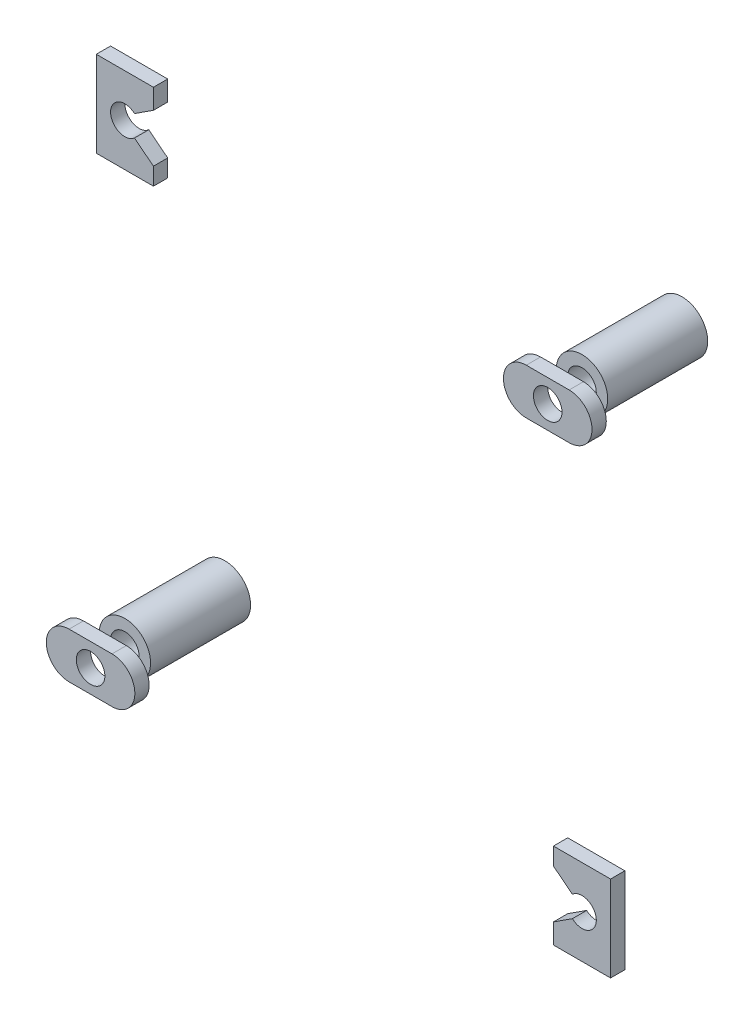
ISO-10303-21;
HEADER;
FILE_DESCRIPTION(('STEP AP214'),'2;1');
FILE_NAME('part.step','',(''),(''),'','','');
FILE_SCHEMA(('AUTOMOTIVE_DESIGN { 1 0 10303 214 1 1 1 1 }'));
ENDSEC;
DATA;
#1=APPLICATION_CONTEXT('core data for automotive mechanical design processes');
#2=APPLICATION_PROTOCOL_DEFINITION('international standard','automotive_design',2000,#1);
#3=PRODUCT_CONTEXT('',#1,'mechanical');
#4=PRODUCT('Part','Part','',(#3));
#5=PRODUCT_RELATED_PRODUCT_CATEGORY('part','',(#4));
#6=PRODUCT_DEFINITION_FORMATION('','',#4);
#7=PRODUCT_DEFINITION_CONTEXT('part definition',#1,'design');
#8=PRODUCT_DEFINITION('design','',#6,#7);
#9=PRODUCT_DEFINITION_SHAPE('','',#8);
#10=(LENGTH_UNIT() NAMED_UNIT(*) SI_UNIT(.MILLI.,.METRE.));
#11=(NAMED_UNIT(*) PLANE_ANGLE_UNIT() SI_UNIT($,.RADIAN.));
#12=(NAMED_UNIT(*) SI_UNIT($,.STERADIAN.) SOLID_ANGLE_UNIT());
#13=UNCERTAINTY_MEASURE_WITH_UNIT(LENGTH_MEASURE(1.E-05),#10,'distance_accuracy_value','');
#14=(GEOMETRIC_REPRESENTATION_CONTEXT(3) GLOBAL_UNCERTAINTY_ASSIGNED_CONTEXT((#13)) GLOBAL_UNIT_ASSIGNED_CONTEXT((#10,
#11,#12)) REPRESENTATION_CONTEXT('',''));
#15=CARTESIAN_POINT('',(0.,0.,0.));
#16=DIRECTION('',(0.,0.,1.));
#17=DIRECTION('',(1.,0.,0.));
#18=AXIS2_PLACEMENT_3D('',#15,#16,#17);
#19=CARTESIAN_POINT('',(-80.,-80.0000000000001,448.285128968018));
#20=DIRECTION('',(0.,0.,1.));
#21=DIRECTION('',(1.,0.,0.));
#22=AXIS2_PLACEMENT_3D('',#19,#20,#21);
#23=PLANE('',#22);
#24=CARTESIAN_POINT('',(-80.,-80.0000000000001,448.285128968018));
#25=DIRECTION('',(0.,0.,1.));
#26=DIRECTION('',(1.,0.,0.));
#27=AXIS2_PLACEMENT_3D('',#24,#25,#26);
#28=CIRCLE('',#27,9.);
#29=CARTESIAN_POINT('',(-71.,-80.0000000000001,448.285128968018));
#30=VERTEX_POINT('',#29);
#31=EDGE_CURVE('P0_E10',#30,#30,#28,.T.);
#32=ORIENTED_EDGE('',*,*,#31,.T.);
#33=EDGE_LOOP('',(#32));
#34=FACE_BOUND('',#33,.T.);
#35=CARTESIAN_POINT('',(-80.,-80.0000000000001,448.285128968018));
#36=DIRECTION('',(0.,0.,1.));
#37=DIRECTION('',(1.,0.,0.));
#38=AXIS2_PLACEMENT_3D('',#35,#36,#37);
#39=CIRCLE('',#38,5.);
#40=CARTESIAN_POINT('',(-75.,-80.0000000000001,448.285128968018));
#41=VERTEX_POINT('',#40);
#42=EDGE_CURVE('P0_E26',#41,#41,#39,.T.);
#43=ORIENTED_EDGE('',*,*,#42,.F.);
#44=EDGE_LOOP('',(#43));
#45=FACE_BOUND('',#44,.T.);
#46=ADVANCED_FACE('P0_F15',(#34,#45),#23,.T.);
#47=CARTESIAN_POINT('',(-80.,-80.0000000000001,413.285128968018));
#48=DIRECTION('',(0.,0.,1.));
#49=DIRECTION('',(1.,0.,0.));
#50=AXIS2_PLACEMENT_3D('',#47,#48,#49);
#51=PLANE('',#50);
#52=CARTESIAN_POINT('',(-80.,-80.0000000000001,413.285128968018));
#53=DIRECTION('',(0.,0.,1.));
#54=DIRECTION('',(1.,0.,0.));
#55=AXIS2_PLACEMENT_3D('',#52,#53,#54);
#56=CIRCLE('',#55,9.);
#57=CARTESIAN_POINT('',(-71.,-80.0000000000001,413.285128968018));
#58=VERTEX_POINT('',#57);
#59=EDGE_CURVE('P0_E19',#58,#58,#56,.T.);
#60=ORIENTED_EDGE('',*,*,#59,.F.);
#61=EDGE_LOOP('',(#60));
#62=FACE_BOUND('',#61,.T.);
#63=CARTESIAN_POINT('',(-80.,-80.0000000000001,413.285128968018));
#64=DIRECTION('',(0.,0.,1.));
#65=DIRECTION('',(1.,0.,0.));
#66=AXIS2_PLACEMENT_3D('',#63,#64,#65);
#67=CIRCLE('',#66,5.);
#68=CARTESIAN_POINT('',(-75.,-80.0000000000001,413.285128968018));
#69=VERTEX_POINT('',#68);
#70=EDGE_CURVE('P0_E28',#69,#69,#67,.T.);
#71=ORIENTED_EDGE('',*,*,#70,.T.);
#72=EDGE_LOOP('',(#71));
#73=FACE_BOUND('',#72,.T.);
#74=ADVANCED_FACE('P0_F38',(#62,#73),#51,.F.);
#75=CARTESIAN_POINT('',(-80.,-80.0000000000001,448.285128968018));
#76=DIRECTION('',(0.,0.,-1.));
#77=DIRECTION('',(-1.,0.,0.));
#78=AXIS2_PLACEMENT_3D('',#75,#76,#77);
#79=CYLINDRICAL_SURFACE('',#78,9.);
#80=ORIENTED_EDGE('',*,*,#31,.F.);
#81=EDGE_LOOP('',(#80));
#82=FACE_BOUND('',#81,.T.);
#83=ORIENTED_EDGE('',*,*,#59,.T.);
#84=EDGE_LOOP('',(#83));
#85=FACE_BOUND('',#84,.T.);
#86=ADVANCED_FACE('P0_F17',(#82,#85),#79,.T.);
#87=CARTESIAN_POINT('',(-80.,-80.0000000000001,448.285128968018));
#88=DIRECTION('',(0.,0.,-1.));
#89=DIRECTION('',(-1.,0.,0.));
#90=AXIS2_PLACEMENT_3D('',#87,#88,#89);
#91=CYLINDRICAL_SURFACE('',#90,5.);
#92=ORIENTED_EDGE('',*,*,#42,.T.);
#93=EDGE_LOOP('',(#92));
#94=FACE_BOUND('',#93,.T.);
#95=ORIENTED_EDGE('',*,*,#70,.F.);
#96=EDGE_LOOP('',(#95));
#97=FACE_BOUND('',#96,.T.);
#98=ADVANCED_FACE('P0_F34',(#94,#97),#91,.F.);
#99=CLOSED_SHELL('',(#46,#74,#86,#98));
#100=MANIFOLD_SOLID_BREP('P0_B1',#99);
#101=CARTESIAN_POINT('',(80.,79.9999999999999,448.285128968018));
#102=DIRECTION('',(0.,0.,1.));
#103=DIRECTION('',(1.,0.,0.));
#104=AXIS2_PLACEMENT_3D('',#101,#102,#103);
#105=PLANE('',#104);
#106=CARTESIAN_POINT('',(80.,79.9999999999999,448.285128968018));
#107=DIRECTION('',(0.,0.,1.));
#108=DIRECTION('',(1.,0.,0.));
#109=AXIS2_PLACEMENT_3D('',#106,#107,#108);
#110=CIRCLE('',#109,9.);
#111=CARTESIAN_POINT('',(89.,79.9999999999999,448.285128968018));
#112=VERTEX_POINT('',#111);
#113=EDGE_CURVE('P1_E10',#112,#112,#110,.T.);
#114=ORIENTED_EDGE('',*,*,#113,.T.);
#115=EDGE_LOOP('',(#114));
#116=FACE_BOUND('',#115,.T.);
#117=CARTESIAN_POINT('',(80.,79.9999999999999,448.285128968018));
#118=DIRECTION('',(0.,0.,1.));
#119=DIRECTION('',(1.,0.,0.));
#120=AXIS2_PLACEMENT_3D('',#117,#118,#119);
#121=CIRCLE('',#120,5.);
#122=CARTESIAN_POINT('',(85.,79.9999999999999,448.285128968018));
#123=VERTEX_POINT('',#122);
#124=EDGE_CURVE('P1_E26',#123,#123,#121,.T.);
#125=ORIENTED_EDGE('',*,*,#124,.F.);
#126=EDGE_LOOP('',(#125));
#127=FACE_BOUND('',#126,.T.);
#128=ADVANCED_FACE('P1_F15',(#116,#127),#105,.T.);
#129=CARTESIAN_POINT('',(80.,79.9999999999999,413.285128968018));
#130=DIRECTION('',(0.,0.,1.));
#131=DIRECTION('',(1.,0.,0.));
#132=AXIS2_PLACEMENT_3D('',#129,#130,#131);
#133=PLANE('',#132);
#134=CARTESIAN_POINT('',(80.,79.9999999999999,413.285128968018));
#135=DIRECTION('',(0.,0.,1.));
#136=DIRECTION('',(1.,0.,0.));
#137=AXIS2_PLACEMENT_3D('',#134,#135,#136);
#138=CIRCLE('',#137,9.);
#139=CARTESIAN_POINT('',(89.,79.9999999999999,413.285128968018));
#140=VERTEX_POINT('',#139);
#141=EDGE_CURVE('P1_E19',#140,#140,#138,.T.);
#142=ORIENTED_EDGE('',*,*,#141,.F.);
#143=EDGE_LOOP('',(#142));
#144=FACE_BOUND('',#143,.T.);
#145=CARTESIAN_POINT('',(80.,79.9999999999999,413.285128968018));
#146=DIRECTION('',(0.,0.,1.));
#147=DIRECTION('',(1.,0.,0.));
#148=AXIS2_PLACEMENT_3D('',#145,#146,#147);
#149=CIRCLE('',#148,5.);
#150=CARTESIAN_POINT('',(85.,79.9999999999999,413.285128968018));
#151=VERTEX_POINT('',#150);
#152=EDGE_CURVE('P1_E28',#151,#151,#149,.T.);
#153=ORIENTED_EDGE('',*,*,#152,.T.);
#154=EDGE_LOOP('',(#153));
#155=FACE_BOUND('',#154,.T.);
#156=ADVANCED_FACE('P1_F38',(#144,#155),#133,.F.);
#157=CARTESIAN_POINT('',(80.,79.9999999999999,448.285128968018));
#158=DIRECTION('',(0.,0.,-1.));
#159=DIRECTION('',(-1.,0.,0.));
#160=AXIS2_PLACEMENT_3D('',#157,#158,#159);
#161=CYLINDRICAL_SURFACE('',#160,9.);
#162=ORIENTED_EDGE('',*,*,#113,.F.);
#163=EDGE_LOOP('',(#162));
#164=FACE_BOUND('',#163,.T.);
#165=ORIENTED_EDGE('',*,*,#141,.T.);
#166=EDGE_LOOP('',(#165));
#167=FACE_BOUND('',#166,.T.);
#168=ADVANCED_FACE('P1_F17',(#164,#167),#161,.T.);
#169=CARTESIAN_POINT('',(80.,79.9999999999999,448.285128968018));
#170=DIRECTION('',(0.,0.,-1.));
#171=DIRECTION('',(-1.,0.,0.));
#172=AXIS2_PLACEMENT_3D('',#169,#170,#171);
#173=CYLINDRICAL_SURFACE('',#172,5.);
#174=ORIENTED_EDGE('',*,*,#124,.T.);
#175=EDGE_LOOP('',(#174));
#176=FACE_BOUND('',#175,.T.);
#177=ORIENTED_EDGE('',*,*,#152,.F.);
#178=EDGE_LOOP('',(#177));
#179=FACE_BOUND('',#178,.T.);
#180=ADVANCED_FACE('P1_F34',(#176,#179),#173,.F.);
#181=CLOSED_SHELL('',(#128,#156,#168,#180));
#182=MANIFOLD_SOLID_BREP('P1_B1',#181);
#183=CARTESIAN_POINT('',(-70.,71.0749620758152,448.285128968018));
#184=DIRECTION('',(-0.618788332961587,-0.785557762987942,0.));
#185=DIRECTION('',(0.785557762987942,-0.618788332961587,0.));
#186=AXIS2_PLACEMENT_3D('',#183,#184,#185);
#187=PLANE('',#186);
#188=DIRECTION('',(-0.785557762987942,0.618788332961587,0.));
#189=VECTOR('',#188,1.);
#190=CARTESIAN_POINT('',(-70.,71.0749620758152,443.285128968018));
#191=LINE('',#190,#189);
#192=CARTESIAN_POINT('',(-70.,71.0749620758152,443.285128968018));
#193=VERTEX_POINT('',#192);
#194=CARTESIAN_POINT('',(-76.6352345462613,76.3015741941568,443.285128968018));
#195=VERTEX_POINT('',#194);
#196=EDGE_CURVE('P2_E111',#193,#195,#191,.T.);
#197=ORIENTED_EDGE('',*,*,#196,.T.);
#198=DIRECTION('',(0.,0.,-1.));
#199=VECTOR('',#198,1.);
#200=CARTESIAN_POINT('',(-76.6352345462613,76.3015741941568,448.285128968018));
#201=LINE('',#200,#199);
#202=CARTESIAN_POINT('',(-76.6352345462613,76.3015741941568,448.285128968018));
#203=VERTEX_POINT('',#202);
#204=EDGE_CURVE('P2_E11',#203,#195,#201,.T.);
#205=ORIENTED_EDGE('',*,*,#204,.F.);
#206=DIRECTION('',(-0.785557762987942,0.618788332961587,0.));
#207=VECTOR('',#206,1.);
#208=CARTESIAN_POINT('',(-70.,71.0749620758152,448.285128968018));
#209=LINE('',#208,#207);
#210=CARTESIAN_POINT('',(-70.,71.0749620758152,448.285128968018));
#211=VERTEX_POINT('',#210);
#212=EDGE_CURVE('P2_E129',#211,#203,#209,.T.);
#213=ORIENTED_EDGE('',*,*,#212,.F.);
#214=DIRECTION('',(0.,0.,-1.));
#215=VECTOR('',#214,1.);
#216=CARTESIAN_POINT('',(-70.,71.0749620758152,448.285128968018));
#217=LINE('',#216,#215);
#218=EDGE_CURVE('P2_E107',#211,#193,#217,.T.);
#219=ORIENTED_EDGE('',*,*,#218,.T.);
#220=EDGE_LOOP('',(#197,#205,#213,#219));
#221=FACE_BOUND('',#220,.T.);
#222=ADVANCED_FACE('P2_F17',(#221),#187,.F.);
#223=CARTESIAN_POINT('',(-80.,79.9999999999999,448.285128968018));
#224=DIRECTION('',(0.,0.,-1.));
#225=DIRECTION('',(1.,0.,0.));
#226=AXIS2_PLACEMENT_3D('',#223,#224,#225);
#227=CYLINDRICAL_SURFACE('',#226,5.);
#228=CARTESIAN_POINT('',(-80.,79.9999999999999,443.285128968018));
#229=DIRECTION('',(0.,0.,-1.));
#230=DIRECTION('',(1.,0.,0.));
#231=AXIS2_PLACEMENT_3D('',#228,#229,#230);
#232=CIRCLE('',#231,5.);
#233=CARTESIAN_POINT('',(-76.6352345462613,83.6984258058431,443.285128968018));
#234=VERTEX_POINT('',#233);
#235=EDGE_CURVE('P2_E114',#195,#234,#232,.T.);
#236=ORIENTED_EDGE('',*,*,#235,.T.);
#237=DIRECTION('',(0.,0.,-1.));
#238=VECTOR('',#237,1.);
#239=CARTESIAN_POINT('',(-76.6352345462613,83.6984258058431,448.285128968018));
#240=LINE('',#239,#238);
#241=CARTESIAN_POINT('',(-76.6352345462613,83.6984258058431,448.285128968018));
#242=VERTEX_POINT('',#241);
#243=EDGE_CURVE('P2_E25',#242,#234,#240,.T.);
#244=ORIENTED_EDGE('',*,*,#243,.F.);
#245=CARTESIAN_POINT('',(-80.,79.9999999999999,448.285128968018));
#246=DIRECTION('',(0.,0.,-1.));
#247=DIRECTION('',(1.,0.,0.));
#248=AXIS2_PLACEMENT_3D('',#245,#246,#247);
#249=CIRCLE('',#248,5.);
#250=EDGE_CURVE('P2_E72',#203,#242,#249,.T.);
#251=ORIENTED_EDGE('',*,*,#250,.F.);
#252=ORIENTED_EDGE('',*,*,#204,.T.);
#253=EDGE_LOOP('',(#236,#244,#251,#252));
#254=FACE_BOUND('',#253,.T.);
#255=ADVANCED_FACE('P2_F143',(#254),#227,.F.);
#256=CARTESIAN_POINT('',(-70.,87.9999999999999,448.285128968018));
#257=DIRECTION('',(0.543980870023785,-0.839097618306813,0.));
#258=DIRECTION('',(0.839097618306813,0.543980870023785,0.));
#259=AXIS2_PLACEMENT_3D('',#256,#257,#258);
#260=PLANE('',#259);
#261=DIRECTION('',(-0.839097618306813,-0.543980870023785,0.));
#262=VECTOR('',#261,1.);
#263=CARTESIAN_POINT('',(-70.,87.9999999999999,443.285128968018));
#264=LINE('',#263,#262);
#265=CARTESIAN_POINT('',(-70.,87.9999999999999,443.285128968018));
#266=VERTEX_POINT('',#265);
#267=EDGE_CURVE('P2_E117',#266,#234,#264,.T.);
#268=ORIENTED_EDGE('',*,*,#267,.F.);
#269=DIRECTION('',(0.,0.,-1.));
#270=VECTOR('',#269,1.);
#271=CARTESIAN_POINT('',(-70.,87.9999999999999,448.285128968018));
#272=LINE('',#271,#270);
#273=CARTESIAN_POINT('',(-70.,87.9999999999999,448.285128968018));
#274=VERTEX_POINT('',#273);
#275=EDGE_CURVE('P2_E136',#274,#266,#272,.T.);
#276=ORIENTED_EDGE('',*,*,#275,.F.);
#277=DIRECTION('',(-0.839097618306813,-0.543980870023785,0.));
#278=VECTOR('',#277,1.);
#279=CARTESIAN_POINT('',(-70.,87.9999999999999,448.285128968018));
#280=LINE('',#279,#278);
#281=EDGE_CURVE('P2_E142',#274,#242,#280,.T.);
#282=ORIENTED_EDGE('',*,*,#281,.T.);
#283=ORIENTED_EDGE('',*,*,#243,.T.);
#284=EDGE_LOOP('',(#268,#276,#282,#283));
#285=FACE_BOUND('',#284,.T.);
#286=ADVANCED_FACE('P2_F140',(#285),#260,.T.);
#287=CARTESIAN_POINT('',(-70.,87.9999999999999,448.285128968018));
#288=DIRECTION('',(-1.,0.,0.));
#289=DIRECTION('',(0.,0.,-1.));
#290=AXIS2_PLACEMENT_3D('',#287,#288,#289);
#291=PLANE('',#290);
#292=DIRECTION('',(0.,1.,0.));
#293=VECTOR('',#292,1.);
#294=CARTESIAN_POINT('',(-70.,87.9999999999999,443.285128968018));
#295=LINE('',#294,#293);
#296=CARTESIAN_POINT('',(-70.,94.9999999999999,443.285128968018));
#297=VERTEX_POINT('',#296);
#298=EDGE_CURVE('P2_E120',#266,#297,#295,.T.);
#299=ORIENTED_EDGE('',*,*,#298,.T.);
#300=DIRECTION('',(0.,0.,-1.));
#301=VECTOR('',#300,1.);
#302=CARTESIAN_POINT('',(-70.,94.9999999999999,448.285128968018));
#303=LINE('',#302,#301);
#304=CARTESIAN_POINT('',(-70.,94.9999999999999,448.285128968018));
#305=VERTEX_POINT('',#304);
#306=EDGE_CURVE('P2_E133',#305,#297,#303,.T.);
#307=ORIENTED_EDGE('',*,*,#306,.F.);
#308=DIRECTION('',(0.,1.,0.));
#309=VECTOR('',#308,1.);
#310=CARTESIAN_POINT('',(-70.,87.9999999999999,448.285128968018));
#311=LINE('',#310,#309);
#312=EDGE_CURVE('P2_E156',#274,#305,#311,.T.);
#313=ORIENTED_EDGE('',*,*,#312,.F.);
#314=ORIENTED_EDGE('',*,*,#275,.T.);
#315=EDGE_LOOP('',(#299,#307,#313,#314));
#316=FACE_BOUND('',#315,.T.);
#317=ADVANCED_FACE('P2_F152',(#316),#291,.F.);
#318=CARTESIAN_POINT('',(-70.,94.9999999999999,448.285128968018));
#319=DIRECTION('',(0.,-1.,0.));
#320=DIRECTION('',(0.,0.,1.));
#321=AXIS2_PLACEMENT_3D('',#318,#319,#320);
#322=PLANE('',#321);
#323=DIRECTION('',(-1.,0.,0.));
#324=VECTOR('',#323,1.);
#325=CARTESIAN_POINT('',(-70.,94.9999999999999,443.285128968018));
#326=LINE('',#325,#324);
#327=CARTESIAN_POINT('',(-90.,94.9999999999999,443.285128968018));
#328=VERTEX_POINT('',#327);
#329=EDGE_CURVE('P2_E122',#297,#328,#326,.T.);
#330=ORIENTED_EDGE('',*,*,#329,.T.);
#331=DIRECTION('',(0.,0.,-1.));
#332=VECTOR('',#331,1.);
#333=CARTESIAN_POINT('',(-90.,94.9999999999999,448.285128968018));
#334=LINE('',#333,#332);
#335=CARTESIAN_POINT('',(-90.,94.9999999999999,448.285128968018));
#336=VERTEX_POINT('',#335);
#337=EDGE_CURVE('P2_E97',#336,#328,#334,.T.);
#338=ORIENTED_EDGE('',*,*,#337,.F.);
#339=DIRECTION('',(-1.,0.,0.));
#340=VECTOR('',#339,1.);
#341=CARTESIAN_POINT('',(-70.,94.9999999999999,448.285128968018));
#342=LINE('',#341,#340);
#343=EDGE_CURVE('P2_E102',#305,#336,#342,.T.);
#344=ORIENTED_EDGE('',*,*,#343,.F.);
#345=ORIENTED_EDGE('',*,*,#306,.T.);
#346=EDGE_LOOP('',(#330,#338,#344,#345));
#347=FACE_BOUND('',#346,.T.);
#348=ADVANCED_FACE('P2_F155',(#347),#322,.F.);
#349=CARTESIAN_POINT('',(-90.,64.9999999999999,448.285128968018));
#350=DIRECTION('',(-1.,0.,0.));
#351=DIRECTION('',(0.,-1.,0.));
#352=AXIS2_PLACEMENT_3D('',#349,#350,#351);
#353=PLANE('',#352);
#354=DIRECTION('',(0.,1.,0.));
#355=VECTOR('',#354,1.);
#356=CARTESIAN_POINT('',(-90.,64.9999999999999,443.285128968018));
#357=LINE('',#356,#355);
#358=CARTESIAN_POINT('',(-90.,64.9999999999999,443.285128968018));
#359=VERTEX_POINT('',#358);
#360=EDGE_CURVE('P2_E92',#359,#328,#357,.T.);
#361=ORIENTED_EDGE('',*,*,#360,.F.);
#362=DIRECTION('',(0.,0.,-1.));
#363=VECTOR('',#362,1.);
#364=CARTESIAN_POINT('',(-90.,64.9999999999999,448.285128968018));
#365=LINE('',#364,#363);
#366=CARTESIAN_POINT('',(-90.,64.9999999999999,448.285128968018));
#367=VERTEX_POINT('',#366);
#368=EDGE_CURVE('P2_E87',#367,#359,#365,.T.);
#369=ORIENTED_EDGE('',*,*,#368,.F.);
#370=DIRECTION('',(0.,1.,0.));
#371=VECTOR('',#370,1.);
#372=CARTESIAN_POINT('',(-90.,64.9999999999999,448.285128968018));
#373=LINE('',#372,#371);
#374=EDGE_CURVE('P2_E90',#367,#336,#373,.T.);
#375=ORIENTED_EDGE('',*,*,#374,.T.);
#376=ORIENTED_EDGE('',*,*,#337,.T.);
#377=EDGE_LOOP('',(#361,#369,#375,#376));
#378=FACE_BOUND('',#377,.T.);
#379=ADVANCED_FACE('P2_F89',(#378),#353,.T.);
#380=CARTESIAN_POINT('',(-70.,64.9999999999999,448.285128968018));
#381=DIRECTION('',(0.,-1.,0.));
#382=DIRECTION('',(0.,0.,1.));
#383=AXIS2_PLACEMENT_3D('',#380,#381,#382);
#384=PLANE('',#383);
#385=DIRECTION('',(-1.,0.,0.));
#386=VECTOR('',#385,1.);
#387=CARTESIAN_POINT('',(-70.,64.9999999999999,443.285128968018));
#388=LINE('',#387,#386);
#389=CARTESIAN_POINT('',(-70.,64.9999999999999,443.285128968018));
#390=VERTEX_POINT('',#389);
#391=EDGE_CURVE('P2_E126',#390,#359,#388,.T.);
#392=ORIENTED_EDGE('',*,*,#391,.F.);
#393=DIRECTION('',(0.,0.,-1.));
#394=VECTOR('',#393,1.);
#395=CARTESIAN_POINT('',(-70.,64.9999999999999,448.285128968018));
#396=LINE('',#395,#394);
#397=CARTESIAN_POINT('',(-70.,64.9999999999999,448.285128968018));
#398=VERTEX_POINT('',#397);
#399=EDGE_CURVE('P2_E61',#398,#390,#396,.T.);
#400=ORIENTED_EDGE('',*,*,#399,.F.);
#401=DIRECTION('',(-1.,0.,0.));
#402=VECTOR('',#401,1.);
#403=CARTESIAN_POINT('',(-70.,64.9999999999999,448.285128968018));
#404=LINE('',#403,#402);
#405=EDGE_CURVE('P2_E100',#398,#367,#404,.T.);
#406=ORIENTED_EDGE('',*,*,#405,.T.);
#407=ORIENTED_EDGE('',*,*,#368,.T.);
#408=EDGE_LOOP('',(#392,#400,#406,#407));
#409=FACE_BOUND('',#408,.T.);
#410=ADVANCED_FACE('P2_F105',(#409),#384,.T.);
#411=CARTESIAN_POINT('',(-70.,64.9999999999999,448.285128968018));
#412=DIRECTION('',(-1.,0.,0.));
#413=DIRECTION('',(0.,-1.,0.));
#414=AXIS2_PLACEMENT_3D('',#411,#412,#413);
#415=PLANE('',#414);
#416=DIRECTION('',(0.,1.,0.));
#417=VECTOR('',#416,1.);
#418=CARTESIAN_POINT('',(-70.,64.9999999999999,443.285128968018));
#419=LINE('',#418,#417);
#420=EDGE_CURVE('P2_E64',#390,#193,#419,.T.);
#421=ORIENTED_EDGE('',*,*,#420,.T.);
#422=ORIENTED_EDGE('',*,*,#218,.F.);
#423=DIRECTION('',(0.,1.,0.));
#424=VECTOR('',#423,1.);
#425=CARTESIAN_POINT('',(-70.,64.9999999999999,448.285128968018));
#426=LINE('',#425,#424);
#427=EDGE_CURVE('P2_E33',#398,#211,#426,.T.);
#428=ORIENTED_EDGE('',*,*,#427,.F.);
#429=ORIENTED_EDGE('',*,*,#399,.T.);
#430=EDGE_LOOP('',(#421,#422,#428,#429));
#431=FACE_BOUND('',#430,.T.);
#432=ADVANCED_FACE('P2_F163',(#431),#415,.F.);
#433=CARTESIAN_POINT('',(-80.,79.9999999999999,448.285128968018));
#434=DIRECTION('',(0.,0.,-1.));
#435=DIRECTION('',(1.,0.,0.));
#436=AXIS2_PLACEMENT_3D('',#433,#434,#435);
#437=PLANE('',#436);
#438=ORIENTED_EDGE('',*,*,#212,.T.);
#439=ORIENTED_EDGE('',*,*,#250,.T.);
#440=ORIENTED_EDGE('',*,*,#281,.F.);
#441=ORIENTED_EDGE('',*,*,#312,.T.);
#442=ORIENTED_EDGE('',*,*,#343,.T.);
#443=ORIENTED_EDGE('',*,*,#374,.F.);
#444=ORIENTED_EDGE('',*,*,#405,.F.);
#445=ORIENTED_EDGE('',*,*,#427,.T.);
#446=EDGE_LOOP('',(#438,#439,#440,#441,#442,#443,#444,#445));
#447=FACE_BOUND('',#446,.T.);
#448=ADVANCED_FACE('P2_F99',(#447),#437,.F.);
#449=CARTESIAN_POINT('',(-80.,79.9999999999999,443.285128968018));
#450=DIRECTION('',(0.,0.,-1.));
#451=DIRECTION('',(1.,0.,0.));
#452=AXIS2_PLACEMENT_3D('',#449,#450,#451);
#453=PLANE('',#452);
#454=ORIENTED_EDGE('',*,*,#196,.F.);
#455=ORIENTED_EDGE('',*,*,#420,.F.);
#456=ORIENTED_EDGE('',*,*,#391,.T.);
#457=ORIENTED_EDGE('',*,*,#360,.T.);
#458=ORIENTED_EDGE('',*,*,#329,.F.);
#459=ORIENTED_EDGE('',*,*,#298,.F.);
#460=ORIENTED_EDGE('',*,*,#267,.T.);
#461=ORIENTED_EDGE('',*,*,#235,.F.);
#462=EDGE_LOOP('',(#454,#455,#456,#457,#458,#459,#460,#461));
#463=FACE_BOUND('',#462,.T.);
#464=ADVANCED_FACE('P2_F148',(#463),#453,.T.);
#465=CLOSED_SHELL('',(#222,#255,#286,#317,#348,#379,#410,#432,#448,#464));
#466=MANIFOLD_SOLID_BREP('P2_B1',#465);
#467=CARTESIAN_POINT('',(70.,-71.0749620758153,448.285128968018));
#468=DIRECTION('',(0.618788332961587,0.785557762987942,0.));
#469=DIRECTION('',(-0.785557762987942,0.618788332961587,0.));
#470=AXIS2_PLACEMENT_3D('',#467,#468,#469);
#471=PLANE('',#470);
#472=DIRECTION('',(0.785557762987942,-0.618788332961587,0.));
#473=VECTOR('',#472,1.);
#474=CARTESIAN_POINT('',(70.,-71.0749620758153,443.285128968018));
#475=LINE('',#474,#473);
#476=CARTESIAN_POINT('',(70.,-71.0749620758153,443.285128968018));
#477=VERTEX_POINT('',#476);
#478=CARTESIAN_POINT('',(76.6352345462613,-76.3015741941569,443.285128968018));
#479=VERTEX_POINT('',#478);
#480=EDGE_CURVE('P3_E110',#477,#479,#475,.T.);
#481=ORIENTED_EDGE('',*,*,#480,.T.);
#482=DIRECTION('',(0.,0.,-1.));
#483=VECTOR('',#482,1.);
#484=CARTESIAN_POINT('',(76.6352345462613,-76.3015741941569,448.285128968018));
#485=LINE('',#484,#483);
#486=CARTESIAN_POINT('',(76.6352345462613,-76.3015741941569,448.285128968018));
#487=VERTEX_POINT('',#486);
#488=EDGE_CURVE('P3_E10',#487,#479,#485,.T.);
#489=ORIENTED_EDGE('',*,*,#488,.F.);
#490=DIRECTION('',(0.785557762987942,-0.618788332961587,0.));
#491=VECTOR('',#490,1.);
#492=CARTESIAN_POINT('',(70.,-71.0749620758153,448.285128968018));
#493=LINE('',#492,#491);
#494=CARTESIAN_POINT('',(70.,-71.0749620758153,448.285128968018));
#495=VERTEX_POINT('',#494);
#496=EDGE_CURVE('P3_E128',#495,#487,#493,.T.);
#497=ORIENTED_EDGE('',*,*,#496,.F.);
#498=DIRECTION('',(0.,0.,-1.));
#499=VECTOR('',#498,1.);
#500=CARTESIAN_POINT('',(70.,-71.0749620758153,448.285128968018));
#501=LINE('',#500,#499);
#502=EDGE_CURVE('P3_E106',#495,#477,#501,.T.);
#503=ORIENTED_EDGE('',*,*,#502,.T.);
#504=EDGE_LOOP('',(#481,#489,#497,#503));
#505=FACE_BOUND('',#504,.T.);
#506=ADVANCED_FACE('P3_F16',(#505),#471,.F.);
#507=CARTESIAN_POINT('',(80.,-80.0000000000001,448.285128968018));
#508=DIRECTION('',(0.,0.,-1.));
#509=DIRECTION('',(-1.,0.,0.));
#510=AXIS2_PLACEMENT_3D('',#507,#508,#509);
#511=CYLINDRICAL_SURFACE('',#510,5.);
#512=CARTESIAN_POINT('',(80.,-80.0000000000001,443.285128968018));
#513=DIRECTION('',(0.,0.,-1.));
#514=DIRECTION('',(-1.,0.,0.));
#515=AXIS2_PLACEMENT_3D('',#512,#513,#514);
#516=CIRCLE('',#515,5.);
#517=CARTESIAN_POINT('',(76.6352345462613,-83.6984258058432,443.285128968018));
#518=VERTEX_POINT('',#517);
#519=EDGE_CURVE('P3_E113',#479,#518,#516,.T.);
#520=ORIENTED_EDGE('',*,*,#519,.T.);
#521=DIRECTION('',(0.,0.,-1.));
#522=VECTOR('',#521,1.);
#523=CARTESIAN_POINT('',(76.6352345462613,-83.6984258058432,448.285128968018));
#524=LINE('',#523,#522);
#525=CARTESIAN_POINT('',(76.6352345462613,-83.6984258058432,448.285128968018));
#526=VERTEX_POINT('',#525);
#527=EDGE_CURVE('P3_E24',#526,#518,#524,.T.);
#528=ORIENTED_EDGE('',*,*,#527,.F.);
#529=CARTESIAN_POINT('',(80.,-80.0000000000001,448.285128968018));
#530=DIRECTION('',(0.,0.,-1.));
#531=DIRECTION('',(-1.,0.,0.));
#532=AXIS2_PLACEMENT_3D('',#529,#530,#531);
#533=CIRCLE('',#532,5.);
#534=EDGE_CURVE('P3_E71',#487,#526,#533,.T.);
#535=ORIENTED_EDGE('',*,*,#534,.F.);
#536=ORIENTED_EDGE('',*,*,#488,.T.);
#537=EDGE_LOOP('',(#520,#528,#535,#536));
#538=FACE_BOUND('',#537,.T.);
#539=ADVANCED_FACE('P3_F142',(#538),#511,.F.);
#540=CARTESIAN_POINT('',(70.,-88.0000000000001,448.285128968018));
#541=DIRECTION('',(-0.543980870023785,0.839097618306813,0.));
#542=DIRECTION('',(-0.839097618306813,-0.543980870023785,0.));
#543=AXIS2_PLACEMENT_3D('',#540,#541,#542);
#544=PLANE('',#543);
#545=DIRECTION('',(0.839097618306813,0.543980870023785,0.));
#546=VECTOR('',#545,1.);
#547=CARTESIAN_POINT('',(70.,-88.0000000000001,443.285128968018));
#548=LINE('',#547,#546);
#549=CARTESIAN_POINT('',(70.,-88.0000000000001,443.285128968018));
#550=VERTEX_POINT('',#549);
#551=EDGE_CURVE('P3_E116',#550,#518,#548,.T.);
#552=ORIENTED_EDGE('',*,*,#551,.F.);
#553=DIRECTION('',(0.,0.,-1.));
#554=VECTOR('',#553,1.);
#555=CARTESIAN_POINT('',(70.,-88.0000000000001,448.285128968018));
#556=LINE('',#555,#554);
#557=CARTESIAN_POINT('',(70.,-88.0000000000001,448.285128968018));
#558=VERTEX_POINT('',#557);
#559=EDGE_CURVE('P3_E135',#558,#550,#556,.T.);
#560=ORIENTED_EDGE('',*,*,#559,.F.);
#561=DIRECTION('',(0.839097618306813,0.543980870023785,0.));
#562=VECTOR('',#561,1.);
#563=CARTESIAN_POINT('',(70.,-88.0000000000001,448.285128968018));
#564=LINE('',#563,#562);
#565=EDGE_CURVE('P3_E141',#558,#526,#564,.T.);
#566=ORIENTED_EDGE('',*,*,#565,.T.);
#567=ORIENTED_EDGE('',*,*,#527,.T.);
#568=EDGE_LOOP('',(#552,#560,#566,#567));
#569=FACE_BOUND('',#568,.T.);
#570=ADVANCED_FACE('P3_F139',(#569),#544,.T.);
#571=CARTESIAN_POINT('',(70.,-88.0000000000001,448.285128968018));
#572=DIRECTION('',(1.,0.,0.));
#573=DIRECTION('',(0.,0.,-1.));
#574=AXIS2_PLACEMENT_3D('',#571,#572,#573);
#575=PLANE('',#574);
#576=DIRECTION('',(0.,-1.,0.));
#577=VECTOR('',#576,1.);
#578=CARTESIAN_POINT('',(70.,-88.0000000000001,443.285128968018));
#579=LINE('',#578,#577);
#580=CARTESIAN_POINT('',(70.,-95.0000000000001,443.285128968018));
#581=VERTEX_POINT('',#580);
#582=EDGE_CURVE('P3_E119',#550,#581,#579,.T.);
#583=ORIENTED_EDGE('',*,*,#582,.T.);
#584=DIRECTION('',(0.,0.,-1.));
#585=VECTOR('',#584,1.);
#586=CARTESIAN_POINT('',(70.,-95.0000000000001,448.285128968018));
#587=LINE('',#586,#585);
#588=CARTESIAN_POINT('',(70.,-95.0000000000001,448.285128968018));
#589=VERTEX_POINT('',#588);
#590=EDGE_CURVE('P3_E132',#589,#581,#587,.T.);
#591=ORIENTED_EDGE('',*,*,#590,.F.);
#592=DIRECTION('',(0.,-1.,0.));
#593=VECTOR('',#592,1.);
#594=CARTESIAN_POINT('',(70.,-88.0000000000001,448.285128968018));
#595=LINE('',#594,#593);
#596=EDGE_CURVE('P3_E155',#558,#589,#595,.T.);
#597=ORIENTED_EDGE('',*,*,#596,.F.);
#598=ORIENTED_EDGE('',*,*,#559,.T.);
#599=EDGE_LOOP('',(#583,#591,#597,#598));
#600=FACE_BOUND('',#599,.T.);
#601=ADVANCED_FACE('P3_F151',(#600),#575,.F.);
#602=CARTESIAN_POINT('',(70.,-95.0000000000001,448.285128968018));
#603=DIRECTION('',(0.,1.,0.));
#604=DIRECTION('',(0.,0.,1.));
#605=AXIS2_PLACEMENT_3D('',#602,#603,#604);
#606=PLANE('',#605);
#607=DIRECTION('',(1.,0.,0.));
#608=VECTOR('',#607,1.);
#609=CARTESIAN_POINT('',(70.,-95.0000000000001,443.285128968018));
#610=LINE('',#609,#608);
#611=CARTESIAN_POINT('',(90.,-95.0000000000001,443.285128968018));
#612=VERTEX_POINT('',#611);
#613=EDGE_CURVE('P3_E121',#581,#612,#610,.T.);
#614=ORIENTED_EDGE('',*,*,#613,.T.);
#615=DIRECTION('',(0.,0.,-1.));
#616=VECTOR('',#615,1.);
#617=CARTESIAN_POINT('',(90.,-95.0000000000001,448.285128968018));
#618=LINE('',#617,#616);
#619=CARTESIAN_POINT('',(90.,-95.0000000000001,448.285128968018));
#620=VERTEX_POINT('',#619);
#621=EDGE_CURVE('P3_E96',#620,#612,#618,.T.);
#622=ORIENTED_EDGE('',*,*,#621,.F.);
#623=DIRECTION('',(1.,0.,0.));
#624=VECTOR('',#623,1.);
#625=CARTESIAN_POINT('',(70.,-95.0000000000001,448.285128968018));
#626=LINE('',#625,#624);
#627=EDGE_CURVE('P3_E101',#589,#620,#626,.T.);
#628=ORIENTED_EDGE('',*,*,#627,.F.);
#629=ORIENTED_EDGE('',*,*,#590,.T.);
#630=EDGE_LOOP('',(#614,#622,#628,#629));
#631=FACE_BOUND('',#630,.T.);
#632=ADVANCED_FACE('P3_F154',(#631),#606,.F.);
#633=CARTESIAN_POINT('',(90.,-65.0000000000001,448.285128968018));
#634=DIRECTION('',(1.,0.,0.));
#635=DIRECTION('',(0.,1.,0.));
#636=AXIS2_PLACEMENT_3D('',#633,#634,#635);
#637=PLANE('',#636);
#638=DIRECTION('',(0.,-1.,0.));
#639=VECTOR('',#638,1.);
#640=CARTESIAN_POINT('',(90.,-65.0000000000001,443.285128968018));
#641=LINE('',#640,#639);
#642=CARTESIAN_POINT('',(90.,-65.0000000000001,443.285128968018));
#643=VERTEX_POINT('',#642);
#644=EDGE_CURVE('P3_E91',#643,#612,#641,.T.);
#645=ORIENTED_EDGE('',*,*,#644,.F.);
#646=DIRECTION('',(0.,0.,-1.));
#647=VECTOR('',#646,1.);
#648=CARTESIAN_POINT('',(90.,-65.0000000000001,448.285128968018));
#649=LINE('',#648,#647);
#650=CARTESIAN_POINT('',(90.,-65.0000000000001,448.285128968018));
#651=VERTEX_POINT('',#650);
#652=EDGE_CURVE('P3_E86',#651,#643,#649,.T.);
#653=ORIENTED_EDGE('',*,*,#652,.F.);
#654=DIRECTION('',(0.,-1.,0.));
#655=VECTOR('',#654,1.);
#656=CARTESIAN_POINT('',(90.,-65.0000000000001,448.285128968018));
#657=LINE('',#656,#655);
#658=EDGE_CURVE('P3_E89',#651,#620,#657,.T.);
#659=ORIENTED_EDGE('',*,*,#658,.T.);
#660=ORIENTED_EDGE('',*,*,#621,.T.);
#661=EDGE_LOOP('',(#645,#653,#659,#660));
#662=FACE_BOUND('',#661,.T.);
#663=ADVANCED_FACE('P3_F88',(#662),#637,.T.);
#664=CARTESIAN_POINT('',(70.,-65.0000000000001,448.285128968018));
#665=DIRECTION('',(0.,1.,0.));
#666=DIRECTION('',(0.,0.,1.));
#667=AXIS2_PLACEMENT_3D('',#664,#665,#666);
#668=PLANE('',#667);
#669=DIRECTION('',(1.,0.,0.));
#670=VECTOR('',#669,1.);
#671=CARTESIAN_POINT('',(70.,-65.0000000000001,443.285128968018));
#672=LINE('',#671,#670);
#673=CARTESIAN_POINT('',(70.,-65.0000000000001,443.285128968018));
#674=VERTEX_POINT('',#673);
#675=EDGE_CURVE('P3_E125',#674,#643,#672,.T.);
#676=ORIENTED_EDGE('',*,*,#675,.F.);
#677=DIRECTION('',(0.,0.,-1.));
#678=VECTOR('',#677,1.);
#679=CARTESIAN_POINT('',(70.,-65.0000000000001,448.285128968018));
#680=LINE('',#679,#678);
#681=CARTESIAN_POINT('',(70.,-65.0000000000001,448.285128968018));
#682=VERTEX_POINT('',#681);
#683=EDGE_CURVE('P3_E60',#682,#674,#680,.T.);
#684=ORIENTED_EDGE('',*,*,#683,.F.);
#685=DIRECTION('',(1.,0.,0.));
#686=VECTOR('',#685,1.);
#687=CARTESIAN_POINT('',(70.,-65.0000000000001,448.285128968018));
#688=LINE('',#687,#686);
#689=EDGE_CURVE('P3_E99',#682,#651,#688,.T.);
#690=ORIENTED_EDGE('',*,*,#689,.T.);
#691=ORIENTED_EDGE('',*,*,#652,.T.);
#692=EDGE_LOOP('',(#676,#684,#690,#691));
#693=FACE_BOUND('',#692,.T.);
#694=ADVANCED_FACE('P3_F104',(#693),#668,.T.);
#695=CARTESIAN_POINT('',(70.,-65.0000000000001,448.285128968018));
#696=DIRECTION('',(1.,0.,0.));
#697=DIRECTION('',(0.,1.,0.));
#698=AXIS2_PLACEMENT_3D('',#695,#696,#697);
#699=PLANE('',#698);
#700=DIRECTION('',(0.,-1.,0.));
#701=VECTOR('',#700,1.);
#702=CARTESIAN_POINT('',(70.,-65.0000000000001,443.285128968018));
#703=LINE('',#702,#701);
#704=EDGE_CURVE('P3_E63',#674,#477,#703,.T.);
#705=ORIENTED_EDGE('',*,*,#704,.T.);
#706=ORIENTED_EDGE('',*,*,#502,.F.);
#707=DIRECTION('',(0.,-1.,0.));
#708=VECTOR('',#707,1.);
#709=CARTESIAN_POINT('',(70.,-65.0000000000001,448.285128968018));
#710=LINE('',#709,#708);
#711=EDGE_CURVE('P3_E32',#682,#495,#710,.T.);
#712=ORIENTED_EDGE('',*,*,#711,.F.);
#713=ORIENTED_EDGE('',*,*,#683,.T.);
#714=EDGE_LOOP('',(#705,#706,#712,#713));
#715=FACE_BOUND('',#714,.T.);
#716=ADVANCED_FACE('P3_F162',(#715),#699,.F.);
#717=CARTESIAN_POINT('',(80.,-80.0000000000001,448.285128968018));
#718=DIRECTION('',(0.,0.,-1.));
#719=DIRECTION('',(-1.,0.,0.));
#720=AXIS2_PLACEMENT_3D('',#717,#718,#719);
#721=PLANE('',#720);
#722=ORIENTED_EDGE('',*,*,#496,.T.);
#723=ORIENTED_EDGE('',*,*,#534,.T.);
#724=ORIENTED_EDGE('',*,*,#565,.F.);
#725=ORIENTED_EDGE('',*,*,#596,.T.);
#726=ORIENTED_EDGE('',*,*,#627,.T.);
#727=ORIENTED_EDGE('',*,*,#658,.F.);
#728=ORIENTED_EDGE('',*,*,#689,.F.);
#729=ORIENTED_EDGE('',*,*,#711,.T.);
#730=EDGE_LOOP('',(#722,#723,#724,#725,#726,#727,#728,#729));
#731=FACE_BOUND('',#730,.T.);
#732=ADVANCED_FACE('P3_F98',(#731),#721,.F.);
#733=CARTESIAN_POINT('',(80.,-80.0000000000001,443.285128968018));
#734=DIRECTION('',(0.,0.,-1.));
#735=DIRECTION('',(-1.,0.,0.));
#736=AXIS2_PLACEMENT_3D('',#733,#734,#735);
#737=PLANE('',#736);
#738=ORIENTED_EDGE('',*,*,#480,.F.);
#739=ORIENTED_EDGE('',*,*,#704,.F.);
#740=ORIENTED_EDGE('',*,*,#675,.T.);
#741=ORIENTED_EDGE('',*,*,#644,.T.);
#742=ORIENTED_EDGE('',*,*,#613,.F.);
#743=ORIENTED_EDGE('',*,*,#582,.F.);
#744=ORIENTED_EDGE('',*,*,#551,.T.);
#745=ORIENTED_EDGE('',*,*,#519,.F.);
#746=EDGE_LOOP('',(#738,#739,#740,#741,#742,#743,#744,#745));
#747=FACE_BOUND('',#746,.T.);
#748=ADVANCED_FACE('P3_F147',(#747),#737,.T.);
#749=CLOSED_SHELL('',(#506,#539,#570,#601,#632,#663,#694,#716,#732,#748));
#750=MANIFOLD_SOLID_BREP('P3_B1',#749);
#751=CARTESIAN_POINT('',(-72.5,-80.0000000000001,460.285128968018));
#752=DIRECTION('',(0.,0.,-1.));
#753=DIRECTION('',(0.,-1.,0.));
#754=AXIS2_PLACEMENT_3D('',#751,#752,#753);
#755=CYLINDRICAL_SURFACE('',#754,8.);
#756=CARTESIAN_POINT('',(-72.5,-80.0000000000001,455.285128968018));
#757=DIRECTION('',(0.,0.,1.));
#758=DIRECTION('',(0.,1.,0.));
#759=AXIS2_PLACEMENT_3D('',#756,#757,#758);
#760=CIRCLE('',#759,8.);
#761=CARTESIAN_POINT('',(-72.5,-88.0000000000001,455.285128968018));
#762=VERTEX_POINT('',#761);
#763=CARTESIAN_POINT('',(-72.5,-72.0000000000001,455.285128968018));
#764=VERTEX_POINT('',#763);
#765=EDGE_CURVE('P4_E82',#762,#764,#760,.T.);
#766=ORIENTED_EDGE('',*,*,#765,.T.);
#767=DIRECTION('',(0.,0.,-1.));
#768=VECTOR('',#767,1.);
#769=CARTESIAN_POINT('',(-72.5,-72.0000000000001,460.285128968018));
#770=LINE('',#769,#768);
#771=CARTESIAN_POINT('',(-72.5,-72.0000000000001,460.285128968018));
#772=VERTEX_POINT('',#771);
#773=EDGE_CURVE('P4_E11',#772,#764,#770,.T.);
#774=ORIENTED_EDGE('',*,*,#773,.F.);
#775=CARTESIAN_POINT('',(-72.5,-80.0000000000001,460.285128968018));
#776=DIRECTION('',(0.,0.,1.));
#777=DIRECTION('',(0.,1.,0.));
#778=AXIS2_PLACEMENT_3D('',#775,#776,#777);
#779=CIRCLE('',#778,8.);
#780=CARTESIAN_POINT('',(-72.5,-88.0000000000001,460.285128968018));
#781=VERTEX_POINT('',#780);
#782=EDGE_CURVE('P4_E69',#781,#772,#779,.T.);
#783=ORIENTED_EDGE('',*,*,#782,.F.);
#784=DIRECTION('',(0.,0.,-1.));
#785=VECTOR('',#784,1.);
#786=CARTESIAN_POINT('',(-72.5,-88.0000000000001,460.285128968018));
#787=LINE('',#786,#785);
#788=EDGE_CURVE('P4_E78',#781,#762,#787,.T.);
#789=ORIENTED_EDGE('',*,*,#788,.T.);
#790=EDGE_LOOP('',(#766,#774,#783,#789));
#791=FACE_BOUND('',#790,.T.);
#792=ADVANCED_FACE('P4_F17',(#791),#755,.T.);
#793=CARTESIAN_POINT('',(-72.5,-72.0000000000001,460.285128968018));
#794=DIRECTION('',(0.,-1.,0.));
#795=DIRECTION('',(1.,0.,0.));
#796=AXIS2_PLACEMENT_3D('',#793,#794,#795);
#797=PLANE('',#796);
#798=DIRECTION('',(-1.,0.,0.));
#799=VECTOR('',#798,1.);
#800=CARTESIAN_POINT('',(-72.5,-72.0000000000001,455.285128968018));
#801=LINE('',#800,#799);
#802=CARTESIAN_POINT('',(-87.5,-72.0000000000001,455.285128968018));
#803=VERTEX_POINT('',#802);
#804=EDGE_CURVE('P4_E73',#764,#803,#801,.T.);
#805=ORIENTED_EDGE('',*,*,#804,.T.);
#806=DIRECTION('',(0.,0.,-1.));
#807=VECTOR('',#806,1.);
#808=CARTESIAN_POINT('',(-87.5,-72.0000000000001,460.285128968018));
#809=LINE('',#808,#807);
#810=CARTESIAN_POINT('',(-87.5,-72.0000000000001,460.285128968018));
#811=VERTEX_POINT('',#810);
#812=EDGE_CURVE('P4_E26',#811,#803,#809,.T.);
#813=ORIENTED_EDGE('',*,*,#812,.F.);
#814=DIRECTION('',(-1.,0.,0.));
#815=VECTOR('',#814,1.);
#816=CARTESIAN_POINT('',(-72.5,-72.0000000000001,460.285128968018));
#817=LINE('',#816,#815);
#818=EDGE_CURVE('P4_E64',#772,#811,#817,.T.);
#819=ORIENTED_EDGE('',*,*,#818,.F.);
#820=ORIENTED_EDGE('',*,*,#773,.T.);
#821=EDGE_LOOP('',(#805,#813,#819,#820));
#822=FACE_BOUND('',#821,.T.);
#823=ADVANCED_FACE('P4_F72',(#822),#797,.F.);
#824=CARTESIAN_POINT('',(-87.5,-80.0000000000001,460.285128968018));
#825=DIRECTION('',(0.,0.,-1.));
#826=DIRECTION('',(0.,-1.,0.));
#827=AXIS2_PLACEMENT_3D('',#824,#825,#826);
#828=CYLINDRICAL_SURFACE('',#827,8.);
#829=CARTESIAN_POINT('',(-87.5,-80.0000000000001,455.285128968018));
#830=DIRECTION('',(0.,0.,1.));
#831=DIRECTION('',(0.,1.,0.));
#832=AXIS2_PLACEMENT_3D('',#829,#830,#831);
#833=CIRCLE('',#832,8.);
#834=CARTESIAN_POINT('',(-87.5,-88.0000000000001,455.285128968018));
#835=VERTEX_POINT('',#834);
#836=EDGE_CURVE('P4_E51',#803,#835,#833,.T.);
#837=ORIENTED_EDGE('',*,*,#836,.T.);
#838=DIRECTION('',(0.,0.,-1.));
#839=VECTOR('',#838,1.);
#840=CARTESIAN_POINT('',(-87.5,-88.0000000000001,460.285128968018));
#841=LINE('',#840,#839);
#842=CARTESIAN_POINT('',(-87.5,-88.0000000000001,460.285128968018));
#843=VERTEX_POINT('',#842);
#844=EDGE_CURVE('P4_E74',#843,#835,#841,.T.);
#845=ORIENTED_EDGE('',*,*,#844,.F.);
#846=CARTESIAN_POINT('',(-87.5,-80.0000000000001,460.285128968018));
#847=DIRECTION('',(0.,0.,1.));
#848=DIRECTION('',(0.,1.,0.));
#849=AXIS2_PLACEMENT_3D('',#846,#847,#848);
#850=CIRCLE('',#849,8.);
#851=EDGE_CURVE('P4_E67',#811,#843,#850,.T.);
#852=ORIENTED_EDGE('',*,*,#851,.F.);
#853=ORIENTED_EDGE('',*,*,#812,.T.);
#854=EDGE_LOOP('',(#837,#845,#852,#853));
#855=FACE_BOUND('',#854,.T.);
#856=ADVANCED_FACE('P4_F76',(#855),#828,.T.);
#857=CARTESIAN_POINT('',(-72.5,-88.0000000000001,460.285128968018));
#858=DIRECTION('',(0.,1.,0.));
#859=DIRECTION('',(-1.,0.,0.));
#860=AXIS2_PLACEMENT_3D('',#857,#858,#859);
#861=PLANE('',#860);
#862=DIRECTION('',(1.,0.,0.));
#863=VECTOR('',#862,1.);
#864=CARTESIAN_POINT('',(-72.5,-88.0000000000001,455.285128968018));
#865=LINE('',#864,#863);
#866=EDGE_CURVE('P4_E57',#835,#762,#865,.T.);
#867=ORIENTED_EDGE('',*,*,#866,.T.);
#868=ORIENTED_EDGE('',*,*,#788,.F.);
#869=DIRECTION('',(1.,0.,0.));
#870=VECTOR('',#869,1.);
#871=CARTESIAN_POINT('',(-72.5,-88.0000000000001,460.285128968018));
#872=LINE('',#871,#870);
#873=EDGE_CURVE('P4_E34',#843,#781,#872,.T.);
#874=ORIENTED_EDGE('',*,*,#873,.F.);
#875=ORIENTED_EDGE('',*,*,#844,.T.);
#876=EDGE_LOOP('',(#867,#868,#874,#875));
#877=FACE_BOUND('',#876,.T.);
#878=ADVANCED_FACE('P4_F89',(#877),#861,.F.);
#879=CARTESIAN_POINT('',(-72.5,-80.0000000000001,460.285128968018));
#880=DIRECTION('',(0.,0.,1.));
#881=DIRECTION('',(0.,1.,0.));
#882=AXIS2_PLACEMENT_3D('',#879,#880,#881);
#883=PLANE('',#882);
#884=CARTESIAN_POINT('',(-80.,-80.0000000000001,460.285128968018));
#885=DIRECTION('',(0.,0.,1.));
#886=DIRECTION('',(0.,1.,0.));
#887=AXIS2_PLACEMENT_3D('',#884,#885,#886);
#888=CIRCLE('',#887,5.);
#889=CARTESIAN_POINT('',(-80.,-75.0000000000001,460.285128968018));
#890=VERTEX_POINT('',#889);
#891=EDGE_CURVE('P4_E95',#890,#890,#888,.T.);
#892=ORIENTED_EDGE('',*,*,#891,.F.);
#893=EDGE_LOOP('',(#892));
#894=FACE_BOUND('',#893,.T.);
#895=ORIENTED_EDGE('',*,*,#782,.T.);
#896=ORIENTED_EDGE('',*,*,#818,.T.);
#897=ORIENTED_EDGE('',*,*,#851,.T.);
#898=ORIENTED_EDGE('',*,*,#873,.T.);
#899=EDGE_LOOP('',(#895,#896,#897,#898));
#900=FACE_BOUND('',#899,.T.);
#901=ADVANCED_FACE('P4_F65',(#894,#900),#883,.T.);
#902=CARTESIAN_POINT('',(-72.5,-80.0000000000001,455.285128968018));
#903=DIRECTION('',(0.,0.,1.));
#904=DIRECTION('',(0.,1.,0.));
#905=AXIS2_PLACEMENT_3D('',#902,#903,#904);
#906=PLANE('',#905);
#907=CARTESIAN_POINT('',(-80.,-80.0000000000001,455.285128968018));
#908=DIRECTION('',(0.,0.,1.));
#909=DIRECTION('',(0.,1.,0.));
#910=AXIS2_PLACEMENT_3D('',#907,#908,#909);
#911=CIRCLE('',#910,5.);
#912=CARTESIAN_POINT('',(-80.,-75.0000000000001,455.285128968018));
#913=VERTEX_POINT('',#912);
#914=EDGE_CURVE('P4_E20',#913,#913,#911,.T.);
#915=ORIENTED_EDGE('',*,*,#914,.T.);
#916=EDGE_LOOP('',(#915));
#917=FACE_BOUND('',#916,.T.);
#918=ORIENTED_EDGE('',*,*,#765,.F.);
#919=ORIENTED_EDGE('',*,*,#866,.F.);
#920=ORIENTED_EDGE('',*,*,#836,.F.);
#921=ORIENTED_EDGE('',*,*,#804,.F.);
#922=EDGE_LOOP('',(#918,#919,#920,#921));
#923=FACE_BOUND('',#922,.T.);
#924=ADVANCED_FACE('P4_F92',(#917,#923),#906,.F.);
#925=CARTESIAN_POINT('',(-80.,-80.0000000000001,450.285128968018));
#926=DIRECTION('',(0.,0.,1.));
#927=DIRECTION('',(0.,1.,0.));
#928=AXIS2_PLACEMENT_3D('',#925,#926,#927);
#929=CYLINDRICAL_SURFACE('',#928,5.);
#930=ORIENTED_EDGE('',*,*,#891,.T.);
#931=EDGE_LOOP('',(#930));
#932=FACE_BOUND('',#931,.T.);
#933=ORIENTED_EDGE('',*,*,#914,.F.);
#934=EDGE_LOOP('',(#933));
#935=FACE_BOUND('',#934,.T.);
#936=ADVANCED_FACE('P4_F103',(#932,#935),#929,.F.);
#937=CLOSED_SHELL('',(#792,#823,#856,#878,#901,#924,#936));
#938=MANIFOLD_SOLID_BREP('P4_B1',#937);
#939=CARTESIAN_POINT('',(87.5,79.9999999999999,460.285128968018));
#940=DIRECTION('',(0.,0.,-1.));
#941=DIRECTION('',(0.,-1.,0.));
#942=AXIS2_PLACEMENT_3D('',#939,#940,#941);
#943=CYLINDRICAL_SURFACE('',#942,8.);
#944=CARTESIAN_POINT('',(87.5,79.9999999999999,455.285128968018));
#945=DIRECTION('',(0.,0.,1.));
#946=DIRECTION('',(0.,1.,0.));
#947=AXIS2_PLACEMENT_3D('',#944,#945,#946);
#948=CIRCLE('',#947,8.);
#949=CARTESIAN_POINT('',(87.5,71.9999999999999,455.285128968018));
#950=VERTEX_POINT('',#949);
#951=CARTESIAN_POINT('',(87.5,87.9999999999999,455.285128968018));
#952=VERTEX_POINT('',#951);
#953=EDGE_CURVE('P5_E82',#950,#952,#948,.T.);
#954=ORIENTED_EDGE('',*,*,#953,.T.);
#955=DIRECTION('',(0.,0.,-1.));
#956=VECTOR('',#955,1.);
#957=CARTESIAN_POINT('',(87.5,87.9999999999999,460.285128968018));
#958=LINE('',#957,#956);
#959=CARTESIAN_POINT('',(87.5,87.9999999999999,460.285128968018));
#960=VERTEX_POINT('',#959);
#961=EDGE_CURVE('P5_E11',#960,#952,#958,.T.);
#962=ORIENTED_EDGE('',*,*,#961,.F.);
#963=CARTESIAN_POINT('',(87.5,79.9999999999999,460.285128968018));
#964=DIRECTION('',(0.,0.,1.));
#965=DIRECTION('',(0.,1.,0.));
#966=AXIS2_PLACEMENT_3D('',#963,#964,#965);
#967=CIRCLE('',#966,8.);
#968=CARTESIAN_POINT('',(87.5,71.9999999999999,460.285128968018));
#969=VERTEX_POINT('',#968);
#970=EDGE_CURVE('P5_E69',#969,#960,#967,.T.);
#971=ORIENTED_EDGE('',*,*,#970,.F.);
#972=DIRECTION('',(0.,0.,-1.));
#973=VECTOR('',#972,1.);
#974=CARTESIAN_POINT('',(87.5,71.9999999999999,460.285128968018));
#975=LINE('',#974,#973);
#976=EDGE_CURVE('P5_E78',#969,#950,#975,.T.);
#977=ORIENTED_EDGE('',*,*,#976,.T.);
#978=EDGE_LOOP('',(#954,#962,#971,#977));
#979=FACE_BOUND('',#978,.T.);
#980=ADVANCED_FACE('P5_F17',(#979),#943,.T.);
#981=CARTESIAN_POINT('',(87.5,87.9999999999999,460.285128968018));
#982=DIRECTION('',(0.,-1.,0.));
#983=DIRECTION('',(1.,0.,0.));
#984=AXIS2_PLACEMENT_3D('',#981,#982,#983);
#985=PLANE('',#984);
#986=DIRECTION('',(-1.,0.,0.));
#987=VECTOR('',#986,1.);
#988=CARTESIAN_POINT('',(87.5,87.9999999999999,455.285128968018));
#989=LINE('',#988,#987);
#990=CARTESIAN_POINT('',(72.5,87.9999999999999,455.285128968018));
#991=VERTEX_POINT('',#990);
#992=EDGE_CURVE('P5_E73',#952,#991,#989,.T.);
#993=ORIENTED_EDGE('',*,*,#992,.T.);
#994=DIRECTION('',(0.,0.,-1.));
#995=VECTOR('',#994,1.);
#996=CARTESIAN_POINT('',(72.5,87.9999999999999,460.285128968018));
#997=LINE('',#996,#995);
#998=CARTESIAN_POINT('',(72.5,87.9999999999999,460.285128968018));
#999=VERTEX_POINT('',#998);
#1000=EDGE_CURVE('P5_E26',#999,#991,#997,.T.);
#1001=ORIENTED_EDGE('',*,*,#1000,.F.);
#1002=DIRECTION('',(-1.,0.,0.));
#1003=VECTOR('',#1002,1.);
#1004=CARTESIAN_POINT('',(87.5,87.9999999999999,460.285128968018));
#1005=LINE('',#1004,#1003);
#1006=EDGE_CURVE('P5_E64',#960,#999,#1005,.T.);
#1007=ORIENTED_EDGE('',*,*,#1006,.F.);
#1008=ORIENTED_EDGE('',*,*,#961,.T.);
#1009=EDGE_LOOP('',(#993,#1001,#1007,#1008));
#1010=FACE_BOUND('',#1009,.T.);
#1011=ADVANCED_FACE('P5_F72',(#1010),#985,.F.);
#1012=CARTESIAN_POINT('',(72.5,79.9999999999999,460.285128968018));
#1013=DIRECTION('',(0.,0.,-1.));
#1014=DIRECTION('',(0.,-1.,0.));
#1015=AXIS2_PLACEMENT_3D('',#1012,#1013,#1014);
#1016=CYLINDRICAL_SURFACE('',#1015,8.);
#1017=CARTESIAN_POINT('',(72.5,79.9999999999999,455.285128968018));
#1018=DIRECTION('',(0.,0.,1.));
#1019=DIRECTION('',(0.,1.,0.));
#1020=AXIS2_PLACEMENT_3D('',#1017,#1018,#1019);
#1021=CIRCLE('',#1020,8.);
#1022=CARTESIAN_POINT('',(72.5,71.9999999999999,455.285128968018));
#1023=VERTEX_POINT('',#1022);
#1024=EDGE_CURVE('P5_E51',#991,#1023,#1021,.T.);
#1025=ORIENTED_EDGE('',*,*,#1024,.T.);
#1026=DIRECTION('',(0.,0.,-1.));
#1027=VECTOR('',#1026,1.);
#1028=CARTESIAN_POINT('',(72.5,71.9999999999999,460.285128968018));
#1029=LINE('',#1028,#1027);
#1030=CARTESIAN_POINT('',(72.5,71.9999999999999,460.285128968018));
#1031=VERTEX_POINT('',#1030);
#1032=EDGE_CURVE('P5_E74',#1031,#1023,#1029,.T.);
#1033=ORIENTED_EDGE('',*,*,#1032,.F.);
#1034=CARTESIAN_POINT('',(72.5,79.9999999999999,460.285128968018));
#1035=DIRECTION('',(0.,0.,1.));
#1036=DIRECTION('',(0.,1.,0.));
#1037=AXIS2_PLACEMENT_3D('',#1034,#1035,#1036);
#1038=CIRCLE('',#1037,8.);
#1039=EDGE_CURVE('P5_E67',#999,#1031,#1038,.T.);
#1040=ORIENTED_EDGE('',*,*,#1039,.F.);
#1041=ORIENTED_EDGE('',*,*,#1000,.T.);
#1042=EDGE_LOOP('',(#1025,#1033,#1040,#1041));
#1043=FACE_BOUND('',#1042,.T.);
#1044=ADVANCED_FACE('P5_F76',(#1043),#1016,.T.);
#1045=CARTESIAN_POINT('',(87.5,71.9999999999999,460.285128968018));
#1046=DIRECTION('',(0.,1.,0.));
#1047=DIRECTION('',(-1.,0.,0.));
#1048=AXIS2_PLACEMENT_3D('',#1045,#1046,#1047);
#1049=PLANE('',#1048);
#1050=DIRECTION('',(1.,0.,0.));
#1051=VECTOR('',#1050,1.);
#1052=CARTESIAN_POINT('',(87.5,71.9999999999999,455.285128968018));
#1053=LINE('',#1052,#1051);
#1054=EDGE_CURVE('P5_E57',#1023,#950,#1053,.T.);
#1055=ORIENTED_EDGE('',*,*,#1054,.T.);
#1056=ORIENTED_EDGE('',*,*,#976,.F.);
#1057=DIRECTION('',(1.,0.,0.));
#1058=VECTOR('',#1057,1.);
#1059=CARTESIAN_POINT('',(87.5,71.9999999999999,460.285128968018));
#1060=LINE('',#1059,#1058);
#1061=EDGE_CURVE('P5_E34',#1031,#969,#1060,.T.);
#1062=ORIENTED_EDGE('',*,*,#1061,.F.);
#1063=ORIENTED_EDGE('',*,*,#1032,.T.);
#1064=EDGE_LOOP('',(#1055,#1056,#1062,#1063));
#1065=FACE_BOUND('',#1064,.T.);
#1066=ADVANCED_FACE('P5_F89',(#1065),#1049,.F.);
#1067=CARTESIAN_POINT('',(87.5,79.9999999999999,460.285128968018));
#1068=DIRECTION('',(0.,0.,1.));
#1069=DIRECTION('',(0.,1.,0.));
#1070=AXIS2_PLACEMENT_3D('',#1067,#1068,#1069);
#1071=PLANE('',#1070);
#1072=CARTESIAN_POINT('',(80.,79.9999999999999,460.285128968018));
#1073=DIRECTION('',(0.,0.,1.));
#1074=DIRECTION('',(0.,1.,0.));
#1075=AXIS2_PLACEMENT_3D('',#1072,#1073,#1074);
#1076=CIRCLE('',#1075,5.);
#1077=CARTESIAN_POINT('',(80.,84.9999999999999,460.285128968018));
#1078=VERTEX_POINT('',#1077);
#1079=EDGE_CURVE('P5_E95',#1078,#1078,#1076,.T.);
#1080=ORIENTED_EDGE('',*,*,#1079,.F.);
#1081=EDGE_LOOP('',(#1080));
#1082=FACE_BOUND('',#1081,.T.);
#1083=ORIENTED_EDGE('',*,*,#970,.T.);
#1084=ORIENTED_EDGE('',*,*,#1006,.T.);
#1085=ORIENTED_EDGE('',*,*,#1039,.T.);
#1086=ORIENTED_EDGE('',*,*,#1061,.T.);
#1087=EDGE_LOOP('',(#1083,#1084,#1085,#1086));
#1088=FACE_BOUND('',#1087,.T.);
#1089=ADVANCED_FACE('P5_F65',(#1082,#1088),#1071,.T.);
#1090=CARTESIAN_POINT('',(87.5,79.9999999999999,455.285128968018));
#1091=DIRECTION('',(0.,0.,1.));
#1092=DIRECTION('',(0.,1.,0.));
#1093=AXIS2_PLACEMENT_3D('',#1090,#1091,#1092);
#1094=PLANE('',#1093);
#1095=CARTESIAN_POINT('',(80.,79.9999999999999,455.285128968018));
#1096=DIRECTION('',(0.,0.,1.));
#1097=DIRECTION('',(0.,1.,0.));
#1098=AXIS2_PLACEMENT_3D('',#1095,#1096,#1097);
#1099=CIRCLE('',#1098,5.);
#1100=CARTESIAN_POINT('',(80.,84.9999999999999,455.285128968018));
#1101=VERTEX_POINT('',#1100);
#1102=EDGE_CURVE('P5_E20',#1101,#1101,#1099,.T.);
#1103=ORIENTED_EDGE('',*,*,#1102,.T.);
#1104=EDGE_LOOP('',(#1103));
#1105=FACE_BOUND('',#1104,.T.);
#1106=ORIENTED_EDGE('',*,*,#953,.F.);
#1107=ORIENTED_EDGE('',*,*,#1054,.F.);
#1108=ORIENTED_EDGE('',*,*,#1024,.F.);
#1109=ORIENTED_EDGE('',*,*,#992,.F.);
#1110=EDGE_LOOP('',(#1106,#1107,#1108,#1109));
#1111=FACE_BOUND('',#1110,.T.);
#1112=ADVANCED_FACE('P5_F92',(#1105,#1111),#1094,.F.);
#1113=CARTESIAN_POINT('',(80.,79.9999999999999,450.285128968018));
#1114=DIRECTION('',(0.,0.,1.));
#1115=DIRECTION('',(0.,1.,0.));
#1116=AXIS2_PLACEMENT_3D('',#1113,#1114,#1115);
#1117=CYLINDRICAL_SURFACE('',#1116,5.);
#1118=ORIENTED_EDGE('',*,*,#1079,.T.);
#1119=EDGE_LOOP('',(#1118));
#1120=FACE_BOUND('',#1119,.T.);
#1121=ORIENTED_EDGE('',*,*,#1102,.F.);
#1122=EDGE_LOOP('',(#1121));
#1123=FACE_BOUND('',#1122,.T.);
#1124=ADVANCED_FACE('P5_F103',(#1120,#1123),#1117,.F.);
#1125=CLOSED_SHELL('',(#980,#1011,#1044,#1066,#1089,#1112,#1124));
#1126=MANIFOLD_SOLID_BREP('P5_B1',#1125);
#1127=ADVANCED_BREP_SHAPE_REPRESENTATION('',(#18,#100,#182,#466,#750,#938,#1126),#14);
#1128=SHAPE_DEFINITION_REPRESENTATION(#9,#1127);
ENDSEC;
END-ISO-10303-21;
